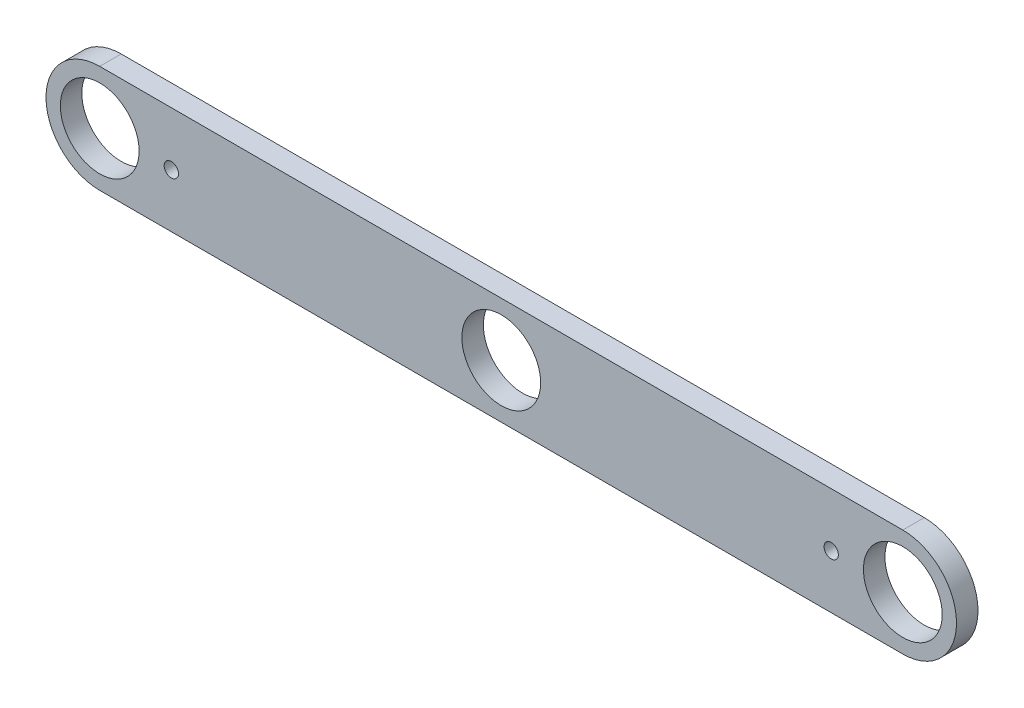
ISO-10303-21;
HEADER;
FILE_DESCRIPTION(('STEP AP214'),'2;1');
FILE_NAME('part.step','',(''),(''),'','','');
FILE_SCHEMA(('AUTOMOTIVE_DESIGN { 1 0 10303 214 1 1 1 1 }'));
ENDSEC;
DATA;
#1=APPLICATION_CONTEXT('core data for automotive mechanical design processes');
#2=APPLICATION_PROTOCOL_DEFINITION('international standard','automotive_design',2000,#1);
#3=PRODUCT_CONTEXT('',#1,'mechanical');
#4=PRODUCT('Part','Part','',(#3));
#5=PRODUCT_RELATED_PRODUCT_CATEGORY('part','',(#4));
#6=PRODUCT_DEFINITION_FORMATION('','',#4);
#7=PRODUCT_DEFINITION_CONTEXT('part definition',#1,'design');
#8=PRODUCT_DEFINITION('design','',#6,#7);
#9=PRODUCT_DEFINITION_SHAPE('','',#8);
#10=(LENGTH_UNIT() NAMED_UNIT(*) SI_UNIT(.MILLI.,.METRE.));
#11=(NAMED_UNIT(*) PLANE_ANGLE_UNIT() SI_UNIT($,.RADIAN.));
#12=(NAMED_UNIT(*) SI_UNIT($,.STERADIAN.) SOLID_ANGLE_UNIT());
#13=UNCERTAINTY_MEASURE_WITH_UNIT(LENGTH_MEASURE(1.E-05),#10,'distance_accuracy_value','');
#14=(GEOMETRIC_REPRESENTATION_CONTEXT(3) GLOBAL_UNCERTAINTY_ASSIGNED_CONTEXT((#13)) GLOBAL_UNIT_ASSIGNED_CONTEXT((#10,
#11,#12)) REPRESENTATION_CONTEXT('',''));
#15=CARTESIAN_POINT('',(0.,0.,0.));
#16=DIRECTION('',(0.,0.,1.));
#17=DIRECTION('',(1.,0.,0.));
#18=AXIS2_PLACEMENT_3D('',#15,#16,#17);
#19=CARTESIAN_POINT('',(112.155,0.,6.));
#20=DIRECTION('',(0.,0.,1.));
#21=DIRECTION('',(1.,0.,0.));
#22=AXIS2_PLACEMENT_3D('',#19,#20,#21);
#23=PLANE('',#22);
#24=CARTESIAN_POINT('',(-92.155,0.,6.));
#25=DIRECTION('',(0.,0.,1.));
#26=DIRECTION('',(1.,0.,0.));
#27=AXIS2_PLACEMENT_3D('',#24,#25,#26);
#28=CIRCLE('',#27,2.);
#29=CARTESIAN_POINT('',(-90.155,0.,6.));
#30=VERTEX_POINT('',#29);
#31=EDGE_CURVE('E153',#30,#30,#28,.T.);
#32=ORIENTED_EDGE('',*,*,#31,.F.);
#33=EDGE_LOOP('',(#32));
#34=FACE_BOUND('',#33,.T.);
#35=CARTESIAN_POINT('',(112.155,0.,6.));
#36=DIRECTION('',(0.,0.,1.));
#37=DIRECTION('',(1.,0.,0.));
#38=AXIS2_PLACEMENT_3D('',#35,#36,#37);
#39=CIRCLE('',#38,11.);
#40=CARTESIAN_POINT('',(123.155,0.,6.));
#41=VERTEX_POINT('',#40);
#42=EDGE_CURVE('E137',#41,#41,#39,.T.);
#43=ORIENTED_EDGE('',*,*,#42,.F.);
#44=EDGE_LOOP('',(#43));
#45=FACE_BOUND('',#44,.T.);
#46=CARTESIAN_POINT('',(112.155,0.,6.));
#47=DIRECTION('',(0.,0.,1.));
#48=DIRECTION('',(1.,0.,0.));
#49=AXIS2_PLACEMENT_3D('',#46,#47,#48);
#50=CIRCLE('',#49,15.);
#51=CARTESIAN_POINT('',(112.155,-14.9999999999999,6.));
#52=VERTEX_POINT('',#51);
#53=CARTESIAN_POINT('',(112.155,15.,6.));
#54=VERTEX_POINT('',#53);
#55=EDGE_CURVE('E95',#52,#54,#50,.T.);
#56=ORIENTED_EDGE('',*,*,#55,.T.);
#57=DIRECTION('',(-1.,0.,0.));
#58=VECTOR('',#57,1.);
#59=CARTESIAN_POINT('',(112.155,15.,6.));
#60=LINE('',#59,#58);
#61=CARTESIAN_POINT('',(-112.155,15.,6.));
#62=VERTEX_POINT('',#61);
#63=EDGE_CURVE('E90',#54,#62,#60,.T.);
#64=ORIENTED_EDGE('',*,*,#63,.T.);
#65=CARTESIAN_POINT('',(-112.155,0.,6.));
#66=DIRECTION('',(0.,0.,1.));
#67=DIRECTION('',(1.,0.,0.));
#68=AXIS2_PLACEMENT_3D('',#65,#66,#67);
#69=CIRCLE('',#68,15.);
#70=CARTESIAN_POINT('',(-112.155,-15.,6.));
#71=VERTEX_POINT('',#70);
#72=EDGE_CURVE('E93',#62,#71,#69,.T.);
#73=ORIENTED_EDGE('',*,*,#72,.T.);
#74=DIRECTION('',(1.,0.,0.));
#75=VECTOR('',#74,1.);
#76=CARTESIAN_POINT('',(112.155,-14.9999999999999,6.));
#77=LINE('',#76,#75);
#78=EDGE_CURVE('E60',#71,#52,#77,.T.);
#79=ORIENTED_EDGE('',*,*,#78,.T.);
#80=EDGE_LOOP('',(#56,#64,#73,#79));
#81=FACE_BOUND('',#80,.T.);
#82=CARTESIAN_POINT('',(0.,0.,6.));
#83=DIRECTION('',(0.,0.,1.));
#84=DIRECTION('',(1.,0.,0.));
#85=AXIS2_PLACEMENT_3D('',#82,#83,#84);
#86=CIRCLE('',#85,11.);
#87=CARTESIAN_POINT('',(11.,0.,6.));
#88=VERTEX_POINT('',#87);
#89=EDGE_CURVE('E115',#88,#88,#86,.T.);
#90=ORIENTED_EDGE('',*,*,#89,.F.);
#91=EDGE_LOOP('',(#90));
#92=FACE_BOUND('',#91,.T.);
#93=CARTESIAN_POINT('',(-112.155,0.,6.));
#94=DIRECTION('',(0.,0.,1.));
#95=DIRECTION('',(1.,0.,0.));
#96=AXIS2_PLACEMENT_3D('',#93,#94,#95);
#97=CIRCLE('',#96,11.);
#98=CARTESIAN_POINT('',(-101.155,0.,6.));
#99=VERTEX_POINT('',#98);
#100=EDGE_CURVE('E145',#99,#99,#97,.T.);
#101=ORIENTED_EDGE('',*,*,#100,.F.);
#102=EDGE_LOOP('',(#101));
#103=FACE_BOUND('',#102,.T.);
#104=CARTESIAN_POINT('',(92.155,0.,6.));
#105=DIRECTION('',(0.,0.,1.));
#106=DIRECTION('',(1.,0.,0.));
#107=AXIS2_PLACEMENT_3D('',#104,#105,#106);
#108=CIRCLE('',#107,2.);
#109=CARTESIAN_POINT('',(94.155,0.,6.));
#110=VERTEX_POINT('',#109);
#111=EDGE_CURVE('E161',#110,#110,#108,.T.);
#112=ORIENTED_EDGE('',*,*,#111,.F.);
#113=EDGE_LOOP('',(#112));
#114=FACE_BOUND('',#113,.T.);
#115=ADVANCED_FACE('F42',(#34,#45,#81,#92,#103,#114),#23,.T.);
#116=CARTESIAN_POINT('',(112.155,0.,0.));
#117=DIRECTION('',(0.,0.,1.));
#118=DIRECTION('',(1.,0.,0.));
#119=AXIS2_PLACEMENT_3D('',#116,#117,#118);
#120=PLANE('',#119);
#121=CARTESIAN_POINT('',(112.155,0.,0.));
#122=DIRECTION('',(0.,0.,1.));
#123=DIRECTION('',(1.,0.,0.));
#124=AXIS2_PLACEMENT_3D('',#121,#122,#123);
#125=CIRCLE('',#124,15.);
#126=CARTESIAN_POINT('',(112.155,-14.9999999999999,0.));
#127=VERTEX_POINT('',#126);
#128=CARTESIAN_POINT('',(112.155,15.,0.));
#129=VERTEX_POINT('',#128);
#130=EDGE_CURVE('E111',#127,#129,#125,.T.);
#131=ORIENTED_EDGE('',*,*,#130,.F.);
#132=DIRECTION('',(1.,0.,0.));
#133=VECTOR('',#132,1.);
#134=CARTESIAN_POINT('',(112.155,-14.9999999999999,0.));
#135=LINE('',#134,#133);
#136=CARTESIAN_POINT('',(-112.155,-15.,0.));
#137=VERTEX_POINT('',#136);
#138=EDGE_CURVE('E83',#137,#127,#135,.T.);
#139=ORIENTED_EDGE('',*,*,#138,.F.);
#140=CARTESIAN_POINT('',(-112.155,0.,0.));
#141=DIRECTION('',(0.,0.,1.));
#142=DIRECTION('',(1.,0.,0.));
#143=AXIS2_PLACEMENT_3D('',#140,#141,#142);
#144=CIRCLE('',#143,15.);
#145=CARTESIAN_POINT('',(-112.155,15.,0.));
#146=VERTEX_POINT('',#145);
#147=EDGE_CURVE('E77',#146,#137,#144,.T.);
#148=ORIENTED_EDGE('',*,*,#147,.F.);
#149=DIRECTION('',(-1.,0.,0.));
#150=VECTOR('',#149,1.);
#151=CARTESIAN_POINT('',(112.155,15.,0.));
#152=LINE('',#151,#150);
#153=EDGE_CURVE('E100',#129,#146,#152,.T.);
#154=ORIENTED_EDGE('',*,*,#153,.F.);
#155=EDGE_LOOP('',(#131,#139,#148,#154));
#156=FACE_BOUND('',#155,.T.);
#157=CARTESIAN_POINT('',(0.,0.,0.));
#158=DIRECTION('',(0.,0.,1.));
#159=DIRECTION('',(1.,0.,0.));
#160=AXIS2_PLACEMENT_3D('',#157,#158,#159);
#161=CIRCLE('',#160,11.);
#162=CARTESIAN_POINT('',(11.,0.,0.));
#163=VERTEX_POINT('',#162);
#164=EDGE_CURVE('E133',#163,#163,#161,.T.);
#165=ORIENTED_EDGE('',*,*,#164,.T.);
#166=EDGE_LOOP('',(#165));
#167=FACE_BOUND('',#166,.T.);
#168=CARTESIAN_POINT('',(112.155,0.,0.));
#169=DIRECTION('',(0.,0.,1.));
#170=DIRECTION('',(1.,0.,0.));
#171=AXIS2_PLACEMENT_3D('',#168,#169,#170);
#172=CIRCLE('',#171,11.);
#173=CARTESIAN_POINT('',(123.155,0.,0.));
#174=VERTEX_POINT('',#173);
#175=EDGE_CURVE('E141',#174,#174,#172,.T.);
#176=ORIENTED_EDGE('',*,*,#175,.T.);
#177=EDGE_LOOP('',(#176));
#178=FACE_BOUND('',#177,.T.);
#179=CARTESIAN_POINT('',(-112.155,0.,0.));
#180=DIRECTION('',(0.,0.,1.));
#181=DIRECTION('',(1.,0.,0.));
#182=AXIS2_PLACEMENT_3D('',#179,#180,#181);
#183=CIRCLE('',#182,11.);
#184=CARTESIAN_POINT('',(-101.155,0.,0.));
#185=VERTEX_POINT('',#184);
#186=EDGE_CURVE('E149',#185,#185,#183,.T.);
#187=ORIENTED_EDGE('',*,*,#186,.T.);
#188=EDGE_LOOP('',(#187));
#189=FACE_BOUND('',#188,.T.);
#190=CARTESIAN_POINT('',(-92.155,0.,0.));
#191=DIRECTION('',(0.,0.,1.));
#192=DIRECTION('',(1.,0.,0.));
#193=AXIS2_PLACEMENT_3D('',#190,#191,#192);
#194=CIRCLE('',#193,2.);
#195=CARTESIAN_POINT('',(-90.155,0.,0.));
#196=VERTEX_POINT('',#195);
#197=EDGE_CURVE('E157',#196,#196,#194,.T.);
#198=ORIENTED_EDGE('',*,*,#197,.T.);
#199=EDGE_LOOP('',(#198));
#200=FACE_BOUND('',#199,.T.);
#201=CARTESIAN_POINT('',(92.155,0.,0.));
#202=DIRECTION('',(0.,0.,1.));
#203=DIRECTION('',(1.,0.,0.));
#204=AXIS2_PLACEMENT_3D('',#201,#202,#203);
#205=CIRCLE('',#204,2.);
#206=CARTESIAN_POINT('',(94.155,0.,0.));
#207=VERTEX_POINT('',#206);
#208=EDGE_CURVE('E165',#207,#207,#205,.T.);
#209=ORIENTED_EDGE('',*,*,#208,.T.);
#210=EDGE_LOOP('',(#209));
#211=FACE_BOUND('',#210,.T.);
#212=ADVANCED_FACE('F128',(#156,#167,#178,#189,#200,#211),#120,.F.);
#213=CARTESIAN_POINT('',(112.155,0.,6.));
#214=DIRECTION('',(0.,0.,-1.));
#215=DIRECTION('',(-1.,0.,0.));
#216=AXIS2_PLACEMENT_3D('',#213,#214,#215);
#217=CYLINDRICAL_SURFACE('',#216,15.);
#218=ORIENTED_EDGE('',*,*,#130,.T.);
#219=DIRECTION('',(0.,0.,-1.));
#220=VECTOR('',#219,1.);
#221=CARTESIAN_POINT('',(112.155,15.,6.));
#222=LINE('',#221,#220);
#223=EDGE_CURVE('E11',#54,#129,#222,.T.);
#224=ORIENTED_EDGE('',*,*,#223,.F.);
#225=ORIENTED_EDGE('',*,*,#55,.F.);
#226=DIRECTION('',(0.,0.,-1.));
#227=VECTOR('',#226,1.);
#228=CARTESIAN_POINT('',(112.155,-14.9999999999999,6.));
#229=LINE('',#228,#227);
#230=EDGE_CURVE('E107',#52,#127,#229,.T.);
#231=ORIENTED_EDGE('',*,*,#230,.T.);
#232=EDGE_LOOP('',(#218,#224,#225,#231));
#233=FACE_BOUND('',#232,.T.);
#234=ADVANCED_FACE('F44',(#233),#217,.T.);
#235=CARTESIAN_POINT('',(112.155,15.,6.));
#236=DIRECTION('',(0.,-1.,0.));
#237=DIRECTION('',(1.,0.,0.));
#238=AXIS2_PLACEMENT_3D('',#235,#236,#237);
#239=PLANE('',#238);
#240=ORIENTED_EDGE('',*,*,#153,.T.);
#241=DIRECTION('',(0.,0.,-1.));
#242=VECTOR('',#241,1.);
#243=CARTESIAN_POINT('',(-112.155,15.,6.));
#244=LINE('',#243,#242);
#245=EDGE_CURVE('E52',#62,#146,#244,.T.);
#246=ORIENTED_EDGE('',*,*,#245,.F.);
#247=ORIENTED_EDGE('',*,*,#63,.F.);
#248=ORIENTED_EDGE('',*,*,#223,.T.);
#249=EDGE_LOOP('',(#240,#246,#247,#248));
#250=FACE_BOUND('',#249,.T.);
#251=ADVANCED_FACE('F99',(#250),#239,.F.);
#252=CARTESIAN_POINT('',(-112.155,0.,6.));
#253=DIRECTION('',(0.,0.,-1.));
#254=DIRECTION('',(-1.,0.,0.));
#255=AXIS2_PLACEMENT_3D('',#252,#253,#254);
#256=CYLINDRICAL_SURFACE('',#255,15.);
#257=ORIENTED_EDGE('',*,*,#147,.T.);
#258=DIRECTION('',(0.,0.,-1.));
#259=VECTOR('',#258,1.);
#260=CARTESIAN_POINT('',(-112.155,-15.,6.));
#261=LINE('',#260,#259);
#262=EDGE_CURVE('E102',#71,#137,#261,.T.);
#263=ORIENTED_EDGE('',*,*,#262,.F.);
#264=ORIENTED_EDGE('',*,*,#72,.F.);
#265=ORIENTED_EDGE('',*,*,#245,.T.);
#266=EDGE_LOOP('',(#257,#263,#264,#265));
#267=FACE_BOUND('',#266,.T.);
#268=ADVANCED_FACE('F103',(#267),#256,.T.);
#269=CARTESIAN_POINT('',(112.155,-14.9999999999999,6.));
#270=DIRECTION('',(0.,1.,0.));
#271=DIRECTION('',(-1.,0.,0.));
#272=AXIS2_PLACEMENT_3D('',#269,#270,#271);
#273=PLANE('',#272);
#274=ORIENTED_EDGE('',*,*,#138,.T.);
#275=ORIENTED_EDGE('',*,*,#230,.F.);
#276=ORIENTED_EDGE('',*,*,#78,.F.);
#277=ORIENTED_EDGE('',*,*,#262,.T.);
#278=EDGE_LOOP('',(#274,#275,#276,#277));
#279=FACE_BOUND('',#278,.T.);
#280=ADVANCED_FACE('F125',(#279),#273,.F.);
#281=CARTESIAN_POINT('',(0.,0.,6.));
#282=DIRECTION('',(0.,0.,-1.));
#283=DIRECTION('',(-1.,0.,0.));
#284=AXIS2_PLACEMENT_3D('',#281,#282,#283);
#285=CYLINDRICAL_SURFACE('',#284,11.);
#286=ORIENTED_EDGE('',*,*,#89,.T.);
#287=EDGE_LOOP('',(#286));
#288=FACE_BOUND('',#287,.T.);
#289=ORIENTED_EDGE('',*,*,#164,.F.);
#290=EDGE_LOOP('',(#289));
#291=FACE_BOUND('',#290,.T.);
#292=ADVANCED_FACE('F186',(#288,#291),#285,.F.);
#293=CARTESIAN_POINT('',(112.155,0.,6.));
#294=DIRECTION('',(0.,0.,-1.));
#295=DIRECTION('',(-1.,0.,0.));
#296=AXIS2_PLACEMENT_3D('',#293,#294,#295);
#297=CYLINDRICAL_SURFACE('',#296,11.);
#298=ORIENTED_EDGE('',*,*,#42,.T.);
#299=EDGE_LOOP('',(#298));
#300=FACE_BOUND('',#299,.T.);
#301=ORIENTED_EDGE('',*,*,#175,.F.);
#302=EDGE_LOOP('',(#301));
#303=FACE_BOUND('',#302,.T.);
#304=ADVANCED_FACE('F240',(#300,#303),#297,.F.);
#305=CARTESIAN_POINT('',(-112.155,0.,6.));
#306=DIRECTION('',(0.,0.,-1.));
#307=DIRECTION('',(-1.,0.,0.));
#308=AXIS2_PLACEMENT_3D('',#305,#306,#307);
#309=CYLINDRICAL_SURFACE('',#308,11.);
#310=ORIENTED_EDGE('',*,*,#100,.T.);
#311=EDGE_LOOP('',(#310));
#312=FACE_BOUND('',#311,.T.);
#313=ORIENTED_EDGE('',*,*,#186,.F.);
#314=EDGE_LOOP('',(#313));
#315=FACE_BOUND('',#314,.T.);
#316=ADVANCED_FACE('F249',(#312,#315),#309,.F.);
#317=CARTESIAN_POINT('',(-92.155,0.,6.));
#318=DIRECTION('',(0.,0.,-1.));
#319=DIRECTION('',(-1.,0.,0.));
#320=AXIS2_PLACEMENT_3D('',#317,#318,#319);
#321=CYLINDRICAL_SURFACE('',#320,2.);
#322=ORIENTED_EDGE('',*,*,#31,.T.);
#323=EDGE_LOOP('',(#322));
#324=FACE_BOUND('',#323,.T.);
#325=ORIENTED_EDGE('',*,*,#197,.F.);
#326=EDGE_LOOP('',(#325));
#327=FACE_BOUND('',#326,.T.);
#328=ADVANCED_FACE('F258',(#324,#327),#321,.F.);
#329=CARTESIAN_POINT('',(92.155,0.,6.));
#330=DIRECTION('',(0.,0.,-1.));
#331=DIRECTION('',(-1.,0.,0.));
#332=AXIS2_PLACEMENT_3D('',#329,#330,#331);
#333=CYLINDRICAL_SURFACE('',#332,2.);
#334=ORIENTED_EDGE('',*,*,#111,.T.);
#335=EDGE_LOOP('',(#334));
#336=FACE_BOUND('',#335,.T.);
#337=ORIENTED_EDGE('',*,*,#208,.F.);
#338=EDGE_LOOP('',(#337));
#339=FACE_BOUND('',#338,.T.);
#340=ADVANCED_FACE('F173',(#336,#339),#333,.F.);
#341=CLOSED_SHELL('',(#115,#212,#234,#251,#268,#280,#292,#304,#316,#328,#340));
#342=MANIFOLD_SOLID_BREP('B2',#341);
#343=ADVANCED_BREP_SHAPE_REPRESENTATION('',(#18,#342),#14);
#344=SHAPE_DEFINITION_REPRESENTATION(#9,#343);
ENDSEC;
END-ISO-10303-21;
